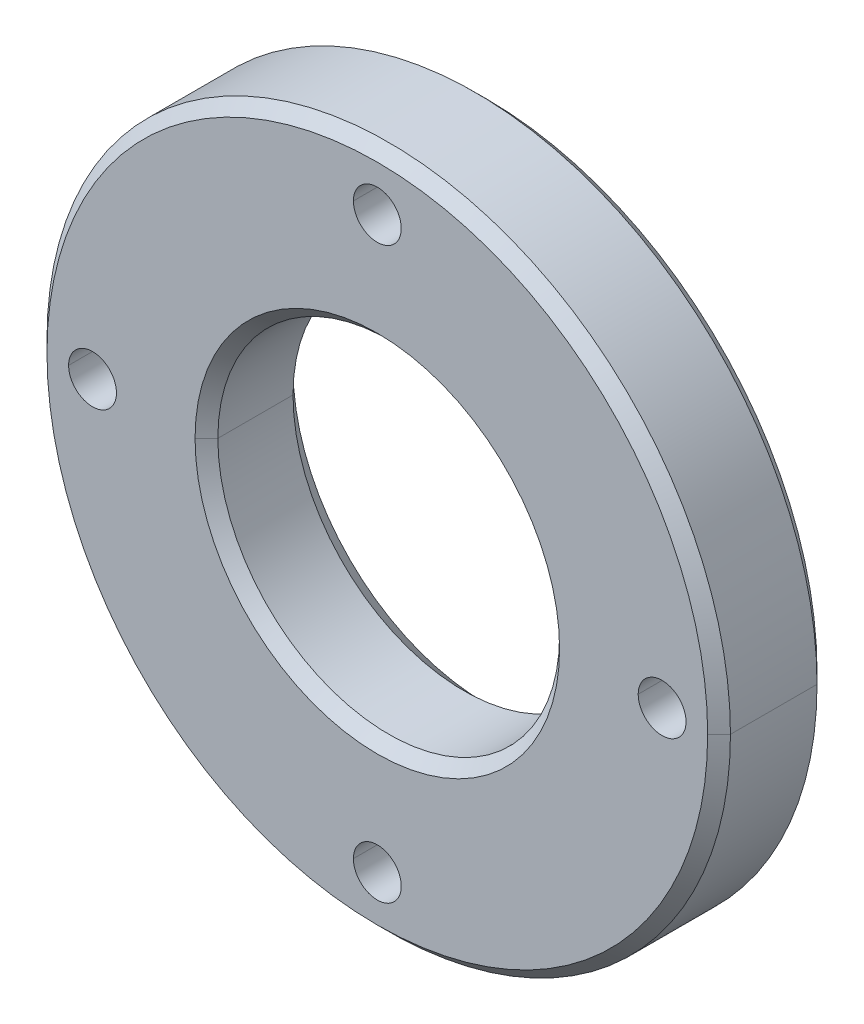
ISO-10303-21;
HEADER;
FILE_DESCRIPTION(('STEP AP214'),'2;1');
FILE_NAME('part.step','',(''),(''),'','','');
FILE_SCHEMA(('AUTOMOTIVE_DESIGN { 1 0 10303 214 1 1 1 1 }'));
ENDSEC;
DATA;
#1=APPLICATION_CONTEXT('core data for automotive mechanical design processes');
#2=APPLICATION_PROTOCOL_DEFINITION('international standard','automotive_design',2000,#1);
#3=PRODUCT_CONTEXT('',#1,'mechanical');
#4=PRODUCT('Part','Part','',(#3));
#5=PRODUCT_RELATED_PRODUCT_CATEGORY('part','',(#4));
#6=PRODUCT_DEFINITION_FORMATION('','',#4);
#7=PRODUCT_DEFINITION_CONTEXT('part definition',#1,'design');
#8=PRODUCT_DEFINITION('design','',#6,#7);
#9=PRODUCT_DEFINITION_SHAPE('','',#8);
#10=(LENGTH_UNIT() NAMED_UNIT(*) SI_UNIT(.MILLI.,.METRE.));
#11=(NAMED_UNIT(*) PLANE_ANGLE_UNIT() SI_UNIT($,.RADIAN.));
#12=(NAMED_UNIT(*) SI_UNIT($,.STERADIAN.) SOLID_ANGLE_UNIT());
#13=UNCERTAINTY_MEASURE_WITH_UNIT(LENGTH_MEASURE(1.E-05),#10,'distance_accuracy_value','');
#14=(GEOMETRIC_REPRESENTATION_CONTEXT(3) GLOBAL_UNCERTAINTY_ASSIGNED_CONTEXT((#13)) GLOBAL_UNIT_ASSIGNED_CONTEXT((#10,
#11,#12)) REPRESENTATION_CONTEXT('',''));
#15=CARTESIAN_POINT('',(0.,0.,0.));
#16=DIRECTION('',(0.,0.,1.));
#17=DIRECTION('',(1.,0.,0.));
#18=AXIS2_PLACEMENT_3D('',#15,#16,#17);
#19=CARTESIAN_POINT('',(0.,14.5,0.));
#20=DIRECTION('',(0.,0.,1.));
#21=DIRECTION('',(1.,0.,0.));
#22=AXIS2_PLACEMENT_3D('',#19,#20,#21);
#23=PLANE('',#22);
#24=CARTESIAN_POINT('',(0.,0.,0.));
#25=DIRECTION('',(0.,0.,-1.));
#26=DIRECTION('',(-1.,0.,0.));
#27=AXIS2_PLACEMENT_3D('',#24,#25,#26);
#28=CIRCLE('',#27,8.);
#29=CARTESIAN_POINT('',(-8.,0.,0.));
#30=VERTEX_POINT('',#29);
#31=CARTESIAN_POINT('',(8.,0.,0.));
#32=VERTEX_POINT('',#31);
#33=EDGE_CURVE('E11',#30,#32,#28,.T.);
#34=ORIENTED_EDGE('',*,*,#33,.T.);
#35=CARTESIAN_POINT('',(0.,0.,0.));
#36=DIRECTION('',(0.,0.,-1.));
#37=DIRECTION('',(-1.,0.,0.));
#38=AXIS2_PLACEMENT_3D('',#35,#36,#37);
#39=CIRCLE('',#38,8.);
#40=EDGE_CURVE('E25',#32,#30,#39,.T.);
#41=ORIENTED_EDGE('',*,*,#40,.T.);
#42=EDGE_LOOP('',(#34,#41));
#43=FACE_BOUND('',#42,.T.);
#44=CARTESIAN_POINT('',(0.,12.5,0.));
#45=DIRECTION('',(0.,0.,-1.));
#46=DIRECTION('',(1.,0.,0.));
#47=AXIS2_PLACEMENT_3D('',#44,#45,#46);
#48=CIRCLE('',#47,1.05);
#49=CARTESIAN_POINT('',(1.05,12.5,0.));
#50=VERTEX_POINT('',#49);
#51=CARTESIAN_POINT('',(-1.05,12.5,0.));
#52=VERTEX_POINT('',#51);
#53=EDGE_CURVE('E143',#50,#52,#48,.T.);
#54=ORIENTED_EDGE('',*,*,#53,.T.);
#55=CARTESIAN_POINT('',(0.,12.5,0.));
#56=DIRECTION('',(0.,0.,-1.));
#57=DIRECTION('',(1.,0.,0.));
#58=AXIS2_PLACEMENT_3D('',#55,#56,#57);
#59=CIRCLE('',#58,1.05);
#60=EDGE_CURVE('E353',#52,#50,#59,.T.);
#61=ORIENTED_EDGE('',*,*,#60,.T.);
#62=EDGE_LOOP('',(#54,#61));
#63=FACE_BOUND('',#62,.T.);
#64=CARTESIAN_POINT('',(-12.5,0.,0.));
#65=DIRECTION('',(0.,0.,-1.));
#66=DIRECTION('',(-1.,0.,0.));
#67=AXIS2_PLACEMENT_3D('',#64,#65,#66);
#68=CIRCLE('',#67,1.05);
#69=CARTESIAN_POINT('',(-13.55,0.,0.));
#70=VERTEX_POINT('',#69);
#71=CARTESIAN_POINT('',(-11.45,0.,0.));
#72=VERTEX_POINT('',#71);
#73=EDGE_CURVE('E349',#70,#72,#68,.T.);
#74=ORIENTED_EDGE('',*,*,#73,.T.);
#75=CARTESIAN_POINT('',(-12.5,0.,0.));
#76=DIRECTION('',(0.,0.,-1.));
#77=DIRECTION('',(-1.,0.,0.));
#78=AXIS2_PLACEMENT_3D('',#75,#76,#77);
#79=CIRCLE('',#78,1.05);
#80=EDGE_CURVE('E345',#72,#70,#79,.T.);
#81=ORIENTED_EDGE('',*,*,#80,.T.);
#82=EDGE_LOOP('',(#74,#81));
#83=FACE_BOUND('',#82,.T.);
#84=CARTESIAN_POINT('',(0.,-12.5,0.));
#85=DIRECTION('',(0.,0.,-1.));
#86=DIRECTION('',(-1.,0.,0.));
#87=AXIS2_PLACEMENT_3D('',#84,#85,#86);
#88=CIRCLE('',#87,1.05);
#89=CARTESIAN_POINT('',(-1.05,-12.5,0.));
#90=VERTEX_POINT('',#89);
#91=CARTESIAN_POINT('',(1.05,-12.5,0.));
#92=VERTEX_POINT('',#91);
#93=EDGE_CURVE('E341',#90,#92,#88,.T.);
#94=ORIENTED_EDGE('',*,*,#93,.T.);
#95=CARTESIAN_POINT('',(0.,-12.5,0.));
#96=DIRECTION('',(0.,0.,-1.));
#97=DIRECTION('',(-1.,0.,0.));
#98=AXIS2_PLACEMENT_3D('',#95,#96,#97);
#99=CIRCLE('',#98,1.05);
#100=EDGE_CURVE('E337',#92,#90,#99,.T.);
#101=ORIENTED_EDGE('',*,*,#100,.T.);
#102=EDGE_LOOP('',(#94,#101));
#103=FACE_BOUND('',#102,.T.);
#104=CARTESIAN_POINT('',(12.5,0.,0.));
#105=DIRECTION('',(0.,0.,-1.));
#106=DIRECTION('',(-1.,0.,0.));
#107=AXIS2_PLACEMENT_3D('',#104,#105,#106);
#108=CIRCLE('',#107,1.05);
#109=CARTESIAN_POINT('',(11.45,0.,0.));
#110=VERTEX_POINT('',#109);
#111=CARTESIAN_POINT('',(13.55,0.,0.));
#112=VERTEX_POINT('',#111);
#113=EDGE_CURVE('E333',#110,#112,#108,.T.);
#114=ORIENTED_EDGE('',*,*,#113,.T.);
#115=CARTESIAN_POINT('',(12.5,0.,0.));
#116=DIRECTION('',(0.,0.,-1.));
#117=DIRECTION('',(-1.,0.,0.));
#118=AXIS2_PLACEMENT_3D('',#115,#116,#117);
#119=CIRCLE('',#118,1.05);
#120=EDGE_CURVE('E329',#112,#110,#119,.T.);
#121=ORIENTED_EDGE('',*,*,#120,.T.);
#122=EDGE_LOOP('',(#114,#121));
#123=FACE_BOUND('',#122,.T.);
#124=CARTESIAN_POINT('',(0.,0.,0.));
#125=DIRECTION('',(0.,0.,-1.));
#126=DIRECTION('',(-1.,0.,0.));
#127=AXIS2_PLACEMENT_3D('',#124,#125,#126);
#128=CIRCLE('',#127,14.5);
#129=CARTESIAN_POINT('',(14.5,0.,0.));
#130=VERTEX_POINT('',#129);
#131=CARTESIAN_POINT('',(-14.5,0.,0.));
#132=VERTEX_POINT('',#131);
#133=EDGE_CURVE('E324',#130,#132,#128,.T.);
#134=ORIENTED_EDGE('',*,*,#133,.F.);
#135=CARTESIAN_POINT('',(0.,0.,0.));
#136=DIRECTION('',(0.,0.,-1.));
#137=DIRECTION('',(-1.,0.,0.));
#138=AXIS2_PLACEMENT_3D('',#135,#136,#137);
#139=CIRCLE('',#138,14.5);
#140=EDGE_CURVE('E319',#132,#130,#139,.T.);
#141=ORIENTED_EDGE('',*,*,#140,.F.);
#142=EDGE_LOOP('',(#134,#141));
#143=FACE_BOUND('',#142,.T.);
#144=ADVANCED_FACE('F17',(#43,#63,#83,#103,#123,#143),#23,.T.);
#145=CARTESIAN_POINT('',(0.,0.,-0.5));
#146=DIRECTION('',(0.,0.,-1.));
#147=DIRECTION('',(0.,-1.,0.));
#148=AXIS2_PLACEMENT_3D('',#145,#146,#147);
#149=CONICAL_SURFACE('',#148,15.,0.785398163397446);
#150=DIRECTION('',(0.707106781186546,0.,-0.707106781186549));
#151=VECTOR('',#150,1.);
#152=CARTESIAN_POINT('',(14.5,0.,0.));
#153=LINE('',#152,#151);
#154=CARTESIAN_POINT('',(15.,0.,-0.5));
#155=VERTEX_POINT('',#154);
#156=EDGE_CURVE('E315',#130,#155,#153,.T.);
#157=ORIENTED_EDGE('',*,*,#156,.T.);
#158=CARTESIAN_POINT('',(0.,0.,-0.5));
#159=DIRECTION('',(0.,0.,-1.));
#160=DIRECTION('',(-1.,0.,0.));
#161=AXIS2_PLACEMENT_3D('',#158,#159,#160);
#162=CIRCLE('',#161,15.);
#163=CARTESIAN_POINT('',(-15.,0.,-0.5));
#164=VERTEX_POINT('',#163);
#165=EDGE_CURVE('E310',#164,#155,#162,.T.);
#166=ORIENTED_EDGE('',*,*,#165,.F.);
#167=DIRECTION('',(-0.707106781186546,0.,-0.707106781186549));
#168=VECTOR('',#167,1.);
#169=CARTESIAN_POINT('',(-14.5,0.,0.));
#170=LINE('',#169,#168);
#171=EDGE_CURVE('E305',#132,#164,#170,.T.);
#172=ORIENTED_EDGE('',*,*,#171,.F.);
#173=ORIENTED_EDGE('',*,*,#140,.T.);
#174=EDGE_LOOP('',(#157,#166,#172,#173));
#175=FACE_BOUND('',#174,.T.);
#176=ADVANCED_FACE('F367',(#175),#149,.T.);
#177=CARTESIAN_POINT('',(0.,0.,-0.5));
#178=DIRECTION('',(0.,0.,-1.));
#179=DIRECTION('',(0.,1.,0.));
#180=AXIS2_PLACEMENT_3D('',#177,#178,#179);
#181=CONICAL_SURFACE('',#180,15.,0.785398163397446);
#182=ORIENTED_EDGE('',*,*,#156,.F.);
#183=ORIENTED_EDGE('',*,*,#133,.T.);
#184=ORIENTED_EDGE('',*,*,#171,.T.);
#185=CARTESIAN_POINT('',(0.,0.,-0.5));
#186=DIRECTION('',(0.,0.,-1.));
#187=DIRECTION('',(-1.,0.,0.));
#188=AXIS2_PLACEMENT_3D('',#185,#186,#187);
#189=CIRCLE('',#188,15.);
#190=EDGE_CURVE('E300',#155,#164,#189,.T.);
#191=ORIENTED_EDGE('',*,*,#190,.F.);
#192=EDGE_LOOP('',(#182,#183,#184,#191));
#193=FACE_BOUND('',#192,.T.);
#194=ADVANCED_FACE('F381',(#193),#181,.T.);
#195=CARTESIAN_POINT('',(0.,0.,-4.8));
#196=DIRECTION('',(0.,0.,-1.));
#197=DIRECTION('',(0.,1.,0.));
#198=AXIS2_PLACEMENT_3D('',#195,#196,#197);
#199=CYLINDRICAL_SURFACE('',#198,15.);
#200=DIRECTION('',(0.,0.,-1.));
#201=VECTOR('',#200,1.);
#202=CARTESIAN_POINT('',(15.,0.,-0.5));
#203=LINE('',#202,#201);
#204=CARTESIAN_POINT('',(15.,0.,-4.3));
#205=VERTEX_POINT('',#204);
#206=EDGE_CURVE('E295',#155,#205,#203,.T.);
#207=ORIENTED_EDGE('',*,*,#206,.F.);
#208=ORIENTED_EDGE('',*,*,#190,.T.);
#209=DIRECTION('',(0.,0.,-1.));
#210=VECTOR('',#209,1.);
#211=CARTESIAN_POINT('',(-15.,0.,-0.500000000000002));
#212=LINE('',#211,#210);
#213=CARTESIAN_POINT('',(-15.,0.,-4.3));
#214=VERTEX_POINT('',#213);
#215=EDGE_CURVE('E291',#164,#214,#212,.T.);
#216=ORIENTED_EDGE('',*,*,#215,.T.);
#217=CARTESIAN_POINT('',(0.,0.,-4.3));
#218=DIRECTION('',(0.,0.,-1.));
#219=DIRECTION('',(-1.,0.,0.));
#220=AXIS2_PLACEMENT_3D('',#217,#218,#219);
#221=CIRCLE('',#220,15.);
#222=EDGE_CURVE('E286',#205,#214,#221,.T.);
#223=ORIENTED_EDGE('',*,*,#222,.F.);
#224=EDGE_LOOP('',(#207,#208,#216,#223));
#225=FACE_BOUND('',#224,.T.);
#226=ADVANCED_FACE('F386',(#225),#199,.T.);
#227=CARTESIAN_POINT('',(0.,0.,-4.8));
#228=DIRECTION('',(0.,0.,1.));
#229=DIRECTION('',(0.,1.,0.));
#230=AXIS2_PLACEMENT_3D('',#227,#228,#229);
#231=CONICAL_SURFACE('',#230,14.5,0.785398163397448);
#232=DIRECTION('',(-0.707106781186548,0.,0.707106781186548));
#233=VECTOR('',#232,1.);
#234=CARTESIAN_POINT('',(-14.5,0.,-4.8));
#235=LINE('',#234,#233);
#236=CARTESIAN_POINT('',(-14.5,0.,-4.8));
#237=VERTEX_POINT('',#236);
#238=EDGE_CURVE('E281',#237,#214,#235,.T.);
#239=ORIENTED_EDGE('',*,*,#238,.F.);
#240=CARTESIAN_POINT('',(0.,0.,-4.8));
#241=DIRECTION('',(0.,0.,-1.));
#242=DIRECTION('',(-1.,0.,0.));
#243=AXIS2_PLACEMENT_3D('',#240,#241,#242);
#244=CIRCLE('',#243,14.5);
#245=CARTESIAN_POINT('',(14.5,0.,-4.8));
#246=VERTEX_POINT('',#245);
#247=EDGE_CURVE('E276',#246,#237,#244,.T.);
#248=ORIENTED_EDGE('',*,*,#247,.F.);
#249=DIRECTION('',(0.707106781186548,0.,0.707106781186548));
#250=VECTOR('',#249,1.);
#251=CARTESIAN_POINT('',(14.5,0.,-4.8));
#252=LINE('',#251,#250);
#253=EDGE_CURVE('E271',#246,#205,#252,.T.);
#254=ORIENTED_EDGE('',*,*,#253,.T.);
#255=ORIENTED_EDGE('',*,*,#222,.T.);
#256=EDGE_LOOP('',(#239,#248,#254,#255));
#257=FACE_BOUND('',#256,.T.);
#258=ADVANCED_FACE('F395',(#257),#231,.T.);
#259=CARTESIAN_POINT('',(0.,0.,-4.8));
#260=DIRECTION('',(0.,0.,1.));
#261=DIRECTION('',(0.,-1.,0.));
#262=AXIS2_PLACEMENT_3D('',#259,#260,#261);
#263=CONICAL_SURFACE('',#262,14.5,0.785398163397448);
#264=ORIENTED_EDGE('',*,*,#238,.T.);
#265=CARTESIAN_POINT('',(0.,0.,-4.3));
#266=DIRECTION('',(0.,0.,-1.));
#267=DIRECTION('',(-1.,0.,0.));
#268=AXIS2_PLACEMENT_3D('',#265,#266,#267);
#269=CIRCLE('',#268,15.);
#270=EDGE_CURVE('E266',#214,#205,#269,.T.);
#271=ORIENTED_EDGE('',*,*,#270,.T.);
#272=ORIENTED_EDGE('',*,*,#253,.F.);
#273=CARTESIAN_POINT('',(0.,0.,-4.8));
#274=DIRECTION('',(0.,0.,-1.));
#275=DIRECTION('',(-1.,0.,0.));
#276=AXIS2_PLACEMENT_3D('',#273,#274,#275);
#277=CIRCLE('',#276,14.5);
#278=EDGE_CURVE('E261',#237,#246,#277,.T.);
#279=ORIENTED_EDGE('',*,*,#278,.F.);
#280=EDGE_LOOP('',(#264,#271,#272,#279));
#281=FACE_BOUND('',#280,.T.);
#282=ADVANCED_FACE('F393',(#281),#263,.T.);
#283=CARTESIAN_POINT('',(0.,8.5,-4.8));
#284=DIRECTION('',(0.,0.,-1.));
#285=DIRECTION('',(-1.,0.,0.));
#286=AXIS2_PLACEMENT_3D('',#283,#284,#285);
#287=PLANE('',#286);
#288=ORIENTED_EDGE('',*,*,#278,.T.);
#289=ORIENTED_EDGE('',*,*,#247,.T.);
#290=EDGE_LOOP('',(#288,#289));
#291=FACE_BOUND('',#290,.T.);
#292=CARTESIAN_POINT('',(0.,0.,-4.8));
#293=DIRECTION('',(0.,0.,-1.));
#294=DIRECTION('',(-1.,0.,0.));
#295=AXIS2_PLACEMENT_3D('',#292,#293,#294);
#296=CIRCLE('',#295,8.5);
#297=CARTESIAN_POINT('',(8.5,0.,-4.8));
#298=VERTEX_POINT('',#297);
#299=CARTESIAN_POINT('',(-8.5,0.,-4.8));
#300=VERTEX_POINT('',#299);
#301=EDGE_CURVE('E256',#298,#300,#296,.T.);
#302=ORIENTED_EDGE('',*,*,#301,.F.);
#303=CARTESIAN_POINT('',(0.,0.,-4.8));
#304=DIRECTION('',(0.,0.,-1.));
#305=DIRECTION('',(-1.,0.,0.));
#306=AXIS2_PLACEMENT_3D('',#303,#304,#305);
#307=CIRCLE('',#306,8.5);
#308=EDGE_CURVE('E251',#300,#298,#307,.T.);
#309=ORIENTED_EDGE('',*,*,#308,.F.);
#310=EDGE_LOOP('',(#302,#309));
#311=FACE_BOUND('',#310,.T.);
#312=ADVANCED_FACE('F397',(#291,#311),#287,.T.);
#313=CARTESIAN_POINT('',(0.,0.,-3.8));
#314=DIRECTION('',(0.,0.,-1.));
#315=DIRECTION('',(0.,-1.,0.));
#316=AXIS2_PLACEMENT_3D('',#313,#314,#315);
#317=CONICAL_SURFACE('',#316,7.5,0.785398163397449);
#318=DIRECTION('',(0.707106781186548,0.,-0.707106781186547));
#319=VECTOR('',#318,1.);
#320=CARTESIAN_POINT('',(7.5,0.,-3.8));
#321=LINE('',#320,#319);
#322=CARTESIAN_POINT('',(7.5,0.,-3.8));
#323=VERTEX_POINT('',#322);
#324=EDGE_CURVE('E246',#323,#298,#321,.T.);
#325=ORIENTED_EDGE('',*,*,#324,.F.);
#326=CARTESIAN_POINT('',(0.,0.,-3.8));
#327=DIRECTION('',(0.,0.,-1.));
#328=DIRECTION('',(-1.,0.,0.));
#329=AXIS2_PLACEMENT_3D('',#326,#327,#328);
#330=CIRCLE('',#329,7.5);
#331=CARTESIAN_POINT('',(-7.5,0.,-3.8));
#332=VERTEX_POINT('',#331);
#333=EDGE_CURVE('E241',#332,#323,#330,.T.);
#334=ORIENTED_EDGE('',*,*,#333,.F.);
#335=DIRECTION('',(-0.707106781186548,0.,-0.707106781186547));
#336=VECTOR('',#335,1.);
#337=CARTESIAN_POINT('',(-7.5,0.,-3.8));
#338=LINE('',#337,#336);
#339=EDGE_CURVE('E236',#332,#300,#338,.T.);
#340=ORIENTED_EDGE('',*,*,#339,.T.);
#341=ORIENTED_EDGE('',*,*,#308,.T.);
#342=EDGE_LOOP('',(#325,#334,#340,#341));
#343=FACE_BOUND('',#342,.T.);
#344=ADVANCED_FACE('F400',(#343),#317,.F.);
#345=CARTESIAN_POINT('',(0.,0.,-3.8));
#346=DIRECTION('',(0.,0.,-1.));
#347=DIRECTION('',(0.,1.,0.));
#348=AXIS2_PLACEMENT_3D('',#345,#346,#347);
#349=CONICAL_SURFACE('',#348,7.5,0.785398163397449);
#350=ORIENTED_EDGE('',*,*,#324,.T.);
#351=ORIENTED_EDGE('',*,*,#301,.T.);
#352=ORIENTED_EDGE('',*,*,#339,.F.);
#353=CARTESIAN_POINT('',(0.,0.,-3.8));
#354=DIRECTION('',(0.,0.,-1.));
#355=DIRECTION('',(-1.,0.,0.));
#356=AXIS2_PLACEMENT_3D('',#353,#354,#355);
#357=CIRCLE('',#356,7.5);
#358=EDGE_CURVE('E231',#323,#332,#357,.T.);
#359=ORIENTED_EDGE('',*,*,#358,.F.);
#360=EDGE_LOOP('',(#350,#351,#352,#359));
#361=FACE_BOUND('',#360,.T.);
#362=ADVANCED_FACE('F405',(#361),#349,.F.);
#363=CARTESIAN_POINT('',(0.,0.,-4.8));
#364=DIRECTION('',(0.,0.,-1.));
#365=DIRECTION('',(0.,1.,0.));
#366=AXIS2_PLACEMENT_3D('',#363,#364,#365);
#367=CYLINDRICAL_SURFACE('',#366,7.5);
#368=DIRECTION('',(0.,0.,-1.));
#369=VECTOR('',#368,1.);
#370=CARTESIAN_POINT('',(7.5,0.,-0.5));
#371=LINE('',#370,#369);
#372=CARTESIAN_POINT('',(7.5,0.,-0.499999999999999));
#373=VERTEX_POINT('',#372);
#374=EDGE_CURVE('E226',#373,#323,#371,.T.);
#375=ORIENTED_EDGE('',*,*,#374,.T.);
#376=ORIENTED_EDGE('',*,*,#358,.T.);
#377=DIRECTION('',(0.,0.,-1.));
#378=VECTOR('',#377,1.);
#379=CARTESIAN_POINT('',(-7.5,0.,-0.5));
#380=LINE('',#379,#378);
#381=CARTESIAN_POINT('',(-7.5,0.,-0.5));
#382=VERTEX_POINT('',#381);
#383=EDGE_CURVE('E221',#382,#332,#380,.T.);
#384=ORIENTED_EDGE('',*,*,#383,.F.);
#385=CARTESIAN_POINT('',(0.,0.,-0.5));
#386=DIRECTION('',(0.,0.,-1.));
#387=DIRECTION('',(-1.,0.,0.));
#388=AXIS2_PLACEMENT_3D('',#385,#386,#387);
#389=CIRCLE('',#388,7.5);
#390=EDGE_CURVE('E216',#373,#382,#389,.T.);
#391=ORIENTED_EDGE('',*,*,#390,.F.);
#392=EDGE_LOOP('',(#375,#376,#384,#391));
#393=FACE_BOUND('',#392,.T.);
#394=ADVANCED_FACE('F408',(#393),#367,.F.);
#395=CARTESIAN_POINT('',(0.,0.,0.));
#396=DIRECTION('',(0.,0.,1.));
#397=DIRECTION('',(0.,1.,0.));
#398=AXIS2_PLACEMENT_3D('',#395,#396,#397);
#399=CONICAL_SURFACE('',#398,8.,0.785398163397449);
#400=DIRECTION('',(-0.707106781186548,0.,0.707106781186547));
#401=VECTOR('',#400,1.);
#402=CARTESIAN_POINT('',(-7.5,0.,-0.499999999999999));
#403=LINE('',#402,#401);
#404=EDGE_CURVE('E212',#382,#30,#403,.T.);
#405=ORIENTED_EDGE('',*,*,#404,.T.);
#406=ORIENTED_EDGE('',*,*,#40,.F.);
#407=DIRECTION('',(0.707106781186548,0.,0.707106781186547));
#408=VECTOR('',#407,1.);
#409=CARTESIAN_POINT('',(7.5,0.,-0.499999999999999));
#410=LINE('',#409,#408);
#411=EDGE_CURVE('E208',#373,#32,#410,.T.);
#412=ORIENTED_EDGE('',*,*,#411,.F.);
#413=ORIENTED_EDGE('',*,*,#390,.T.);
#414=EDGE_LOOP('',(#405,#406,#412,#413));
#415=FACE_BOUND('',#414,.T.);
#416=ADVANCED_FACE('F418',(#415),#399,.F.);
#417=CARTESIAN_POINT('',(0.,0.,0.));
#418=DIRECTION('',(0.,0.,1.));
#419=DIRECTION('',(0.,-1.,0.));
#420=AXIS2_PLACEMENT_3D('',#417,#418,#419);
#421=CONICAL_SURFACE('',#420,8.,0.785398163397449);
#422=ORIENTED_EDGE('',*,*,#404,.F.);
#423=CARTESIAN_POINT('',(0.,0.,-0.5));
#424=DIRECTION('',(0.,0.,-1.));
#425=DIRECTION('',(-1.,0.,0.));
#426=AXIS2_PLACEMENT_3D('',#423,#424,#425);
#427=CIRCLE('',#426,7.5);
#428=EDGE_CURVE('E203',#382,#373,#427,.T.);
#429=ORIENTED_EDGE('',*,*,#428,.T.);
#430=ORIENTED_EDGE('',*,*,#411,.T.);
#431=ORIENTED_EDGE('',*,*,#33,.F.);
#432=EDGE_LOOP('',(#422,#429,#430,#431));
#433=FACE_BOUND('',#432,.T.);
#434=ADVANCED_FACE('F416',(#433),#421,.F.);
#435=CARTESIAN_POINT('',(0.,0.,-4.8));
#436=DIRECTION('',(0.,0.,-1.));
#437=DIRECTION('',(-2.45264421585441E-11,-1.,0.));
#438=AXIS2_PLACEMENT_3D('',#435,#436,#437);
#439=CYLINDRICAL_SURFACE('',#438,7.5);
#440=ORIENTED_EDGE('',*,*,#374,.F.);
#441=ORIENTED_EDGE('',*,*,#428,.F.);
#442=ORIENTED_EDGE('',*,*,#383,.T.);
#443=ORIENTED_EDGE('',*,*,#333,.T.);
#444=EDGE_LOOP('',(#440,#441,#442,#443));
#445=FACE_BOUND('',#444,.T.);
#446=ADVANCED_FACE('F412',(#445),#439,.F.);
#447=CARTESIAN_POINT('',(0.,0.,-4.8));
#448=DIRECTION('',(0.,0.,-1.));
#449=DIRECTION('',(0.,-1.,0.));
#450=AXIS2_PLACEMENT_3D('',#447,#448,#449);
#451=CYLINDRICAL_SURFACE('',#450,15.);
#452=ORIENTED_EDGE('',*,*,#206,.T.);
#453=ORIENTED_EDGE('',*,*,#270,.F.);
#454=ORIENTED_EDGE('',*,*,#215,.F.);
#455=ORIENTED_EDGE('',*,*,#165,.T.);
#456=EDGE_LOOP('',(#452,#453,#454,#455));
#457=FACE_BOUND('',#456,.T.);
#458=ADVANCED_FACE('F389',(#457),#451,.T.);
#459=CARTESIAN_POINT('',(12.5,0.,-3.5));
#460=DIRECTION('',(0.,0.,-1.));
#461=DIRECTION('',(0.,1.,0.));
#462=AXIS2_PLACEMENT_3D('',#459,#460,#461);
#463=CYLINDRICAL_SURFACE('',#462,1.05);
#464=DIRECTION('',(0.,0.,-1.));
#465=VECTOR('',#464,1.);
#466=CARTESIAN_POINT('',(13.55,0.,0.));
#467=LINE('',#466,#465);
#468=CARTESIAN_POINT('',(13.55,0.,-3.5));
#469=VERTEX_POINT('',#468);
#470=EDGE_CURVE('E199',#112,#469,#467,.T.);
#471=ORIENTED_EDGE('',*,*,#470,.T.);
#472=CARTESIAN_POINT('',(12.5,0.,-3.5));
#473=DIRECTION('',(0.,0.,-1.));
#474=DIRECTION('',(-1.,0.,0.));
#475=AXIS2_PLACEMENT_3D('',#472,#473,#474);
#476=CIRCLE('',#475,1.05);
#477=CARTESIAN_POINT('',(11.45,0.,-3.5));
#478=VERTEX_POINT('',#477);
#479=EDGE_CURVE('E195',#469,#478,#476,.T.);
#480=ORIENTED_EDGE('',*,*,#479,.T.);
#481=DIRECTION('',(0.,0.,-1.));
#482=VECTOR('',#481,1.);
#483=CARTESIAN_POINT('',(11.45,0.,0.));
#484=LINE('',#483,#482);
#485=EDGE_CURVE('E190',#110,#478,#484,.T.);
#486=ORIENTED_EDGE('',*,*,#485,.F.);
#487=ORIENTED_EDGE('',*,*,#120,.F.);
#488=EDGE_LOOP('',(#471,#480,#486,#487));
#489=FACE_BOUND('',#488,.T.);
#490=ADVANCED_FACE('F513',(#489),#463,.F.);
#491=CARTESIAN_POINT('',(12.5,0.,-3.5));
#492=DIRECTION('',(0.,0.,-1.));
#493=DIRECTION('',(0.,-1.,0.));
#494=AXIS2_PLACEMENT_3D('',#491,#492,#493);
#495=CYLINDRICAL_SURFACE('',#494,1.05);
#496=ORIENTED_EDGE('',*,*,#470,.F.);
#497=ORIENTED_EDGE('',*,*,#113,.F.);
#498=ORIENTED_EDGE('',*,*,#485,.T.);
#499=CARTESIAN_POINT('',(12.5,0.,-3.5));
#500=DIRECTION('',(0.,0.,-1.));
#501=DIRECTION('',(-1.,0.,0.));
#502=AXIS2_PLACEMENT_3D('',#499,#500,#501);
#503=CIRCLE('',#502,1.05);
#504=EDGE_CURVE('E185',#478,#469,#503,.T.);
#505=ORIENTED_EDGE('',*,*,#504,.T.);
#506=EDGE_LOOP('',(#496,#497,#498,#505));
#507=FACE_BOUND('',#506,.T.);
#508=ADVANCED_FACE('F523',(#507),#495,.F.);
#509=CARTESIAN_POINT('',(12.5,1.05,-3.5));
#510=DIRECTION('',(0.,0.,1.));
#511=DIRECTION('',(1.,0.,0.));
#512=AXIS2_PLACEMENT_3D('',#509,#510,#511);
#513=PLANE('',#512);
#514=ORIENTED_EDGE('',*,*,#479,.F.);
#515=ORIENTED_EDGE('',*,*,#504,.F.);
#516=EDGE_LOOP('',(#514,#515));
#517=FACE_BOUND('',#516,.T.);
#518=ADVANCED_FACE('F534',(#517),#513,.T.);
#519=CARTESIAN_POINT('',(0.,-12.5,-3.5));
#520=DIRECTION('',(0.,0.,-1.));
#521=DIRECTION('',(0.,1.,0.));
#522=AXIS2_PLACEMENT_3D('',#519,#520,#521);
#523=CYLINDRICAL_SURFACE('',#522,1.05);
#524=DIRECTION('',(0.,0.,-1.));
#525=VECTOR('',#524,1.);
#526=CARTESIAN_POINT('',(1.05,-12.5,0.));
#527=LINE('',#526,#525);
#528=CARTESIAN_POINT('',(1.05,-12.5,-3.5));
#529=VERTEX_POINT('',#528);
#530=EDGE_CURVE('E181',#92,#529,#527,.T.);
#531=ORIENTED_EDGE('',*,*,#530,.T.);
#532=CARTESIAN_POINT('',(0.,-12.5,-3.5));
#533=DIRECTION('',(0.,0.,-1.));
#534=DIRECTION('',(-1.,0.,0.));
#535=AXIS2_PLACEMENT_3D('',#532,#533,#534);
#536=CIRCLE('',#535,1.05);
#537=CARTESIAN_POINT('',(-1.05,-12.5,-3.5));
#538=VERTEX_POINT('',#537);
#539=EDGE_CURVE('E177',#529,#538,#536,.T.);
#540=ORIENTED_EDGE('',*,*,#539,.T.);
#541=DIRECTION('',(0.,0.,-1.));
#542=VECTOR('',#541,1.);
#543=CARTESIAN_POINT('',(-1.05,-12.5,0.));
#544=LINE('',#543,#542);
#545=EDGE_CURVE('E172',#90,#538,#544,.T.);
#546=ORIENTED_EDGE('',*,*,#545,.F.);
#547=ORIENTED_EDGE('',*,*,#100,.F.);
#548=EDGE_LOOP('',(#531,#540,#546,#547));
#549=FACE_BOUND('',#548,.T.);
#550=ADVANCED_FACE('F545',(#549),#523,.F.);
#551=CARTESIAN_POINT('',(0.,-12.5,-3.5));
#552=DIRECTION('',(0.,0.,-1.));
#553=DIRECTION('',(0.,-1.,0.));
#554=AXIS2_PLACEMENT_3D('',#551,#552,#553);
#555=CYLINDRICAL_SURFACE('',#554,1.05);
#556=ORIENTED_EDGE('',*,*,#530,.F.);
#557=ORIENTED_EDGE('',*,*,#93,.F.);
#558=ORIENTED_EDGE('',*,*,#545,.T.);
#559=CARTESIAN_POINT('',(0.,-12.5,-3.5));
#560=DIRECTION('',(0.,0.,-1.));
#561=DIRECTION('',(-1.,0.,0.));
#562=AXIS2_PLACEMENT_3D('',#559,#560,#561);
#563=CIRCLE('',#562,1.05);
#564=EDGE_CURVE('E167',#538,#529,#563,.T.);
#565=ORIENTED_EDGE('',*,*,#564,.T.);
#566=EDGE_LOOP('',(#556,#557,#558,#565));
#567=FACE_BOUND('',#566,.T.);
#568=ADVANCED_FACE('F556',(#567),#555,.F.);
#569=CARTESIAN_POINT('',(0.,-11.45,-3.5));
#570=DIRECTION('',(0.,0.,1.));
#571=DIRECTION('',(1.,0.,0.));
#572=AXIS2_PLACEMENT_3D('',#569,#570,#571);
#573=PLANE('',#572);
#574=ORIENTED_EDGE('',*,*,#539,.F.);
#575=ORIENTED_EDGE('',*,*,#564,.F.);
#576=EDGE_LOOP('',(#574,#575));
#577=FACE_BOUND('',#576,.T.);
#578=ADVANCED_FACE('F567',(#577),#573,.T.);
#579=CARTESIAN_POINT('',(-12.5,0.,-3.5));
#580=DIRECTION('',(0.,0.,-1.));
#581=DIRECTION('',(0.,1.,0.));
#582=AXIS2_PLACEMENT_3D('',#579,#580,#581);
#583=CYLINDRICAL_SURFACE('',#582,1.05);
#584=DIRECTION('',(0.,0.,-1.));
#585=VECTOR('',#584,1.);
#586=CARTESIAN_POINT('',(-11.45,0.,0.));
#587=LINE('',#586,#585);
#588=CARTESIAN_POINT('',(-11.45,0.,-3.5));
#589=VERTEX_POINT('',#588);
#590=EDGE_CURVE('E163',#72,#589,#587,.T.);
#591=ORIENTED_EDGE('',*,*,#590,.T.);
#592=CARTESIAN_POINT('',(-12.5,0.,-3.5));
#593=DIRECTION('',(0.,0.,-1.));
#594=DIRECTION('',(-1.,0.,0.));
#595=AXIS2_PLACEMENT_3D('',#592,#593,#594);
#596=CIRCLE('',#595,1.05);
#597=CARTESIAN_POINT('',(-13.55,0.,-3.5));
#598=VERTEX_POINT('',#597);
#599=EDGE_CURVE('E159',#589,#598,#596,.T.);
#600=ORIENTED_EDGE('',*,*,#599,.T.);
#601=DIRECTION('',(0.,0.,-1.));
#602=VECTOR('',#601,1.);
#603=CARTESIAN_POINT('',(-13.55,0.,0.));
#604=LINE('',#603,#602);
#605=EDGE_CURVE('E147',#70,#598,#604,.T.);
#606=ORIENTED_EDGE('',*,*,#605,.F.);
#607=ORIENTED_EDGE('',*,*,#80,.F.);
#608=EDGE_LOOP('',(#591,#600,#606,#607));
#609=FACE_BOUND('',#608,.T.);
#610=ADVANCED_FACE('F578',(#609),#583,.F.);
#611=CARTESIAN_POINT('',(-12.5,0.,-3.5));
#612=DIRECTION('',(0.,0.,-1.));
#613=DIRECTION('',(0.,-1.,0.));
#614=AXIS2_PLACEMENT_3D('',#611,#612,#613);
#615=CYLINDRICAL_SURFACE('',#614,1.05);
#616=ORIENTED_EDGE('',*,*,#590,.F.);
#617=ORIENTED_EDGE('',*,*,#73,.F.);
#618=ORIENTED_EDGE('',*,*,#605,.T.);
#619=CARTESIAN_POINT('',(-12.5,0.,-3.5));
#620=DIRECTION('',(0.,0.,-1.));
#621=DIRECTION('',(-1.,0.,0.));
#622=AXIS2_PLACEMENT_3D('',#619,#620,#621);
#623=CIRCLE('',#622,1.05);
#624=EDGE_CURVE('E144',#598,#589,#623,.T.);
#625=ORIENTED_EDGE('',*,*,#624,.T.);
#626=EDGE_LOOP('',(#616,#617,#618,#625));
#627=FACE_BOUND('',#626,.T.);
#628=ADVANCED_FACE('F589',(#627),#615,.F.);
#629=CARTESIAN_POINT('',(-12.5,1.05,-3.5));
#630=DIRECTION('',(0.,0.,1.));
#631=DIRECTION('',(1.,0.,0.));
#632=AXIS2_PLACEMENT_3D('',#629,#630,#631);
#633=PLANE('',#632);
#634=ORIENTED_EDGE('',*,*,#599,.F.);
#635=ORIENTED_EDGE('',*,*,#624,.F.);
#636=EDGE_LOOP('',(#634,#635));
#637=FACE_BOUND('',#636,.T.);
#638=ADVANCED_FACE('F600',(#637),#633,.T.);
#639=CARTESIAN_POINT('',(0.,12.5,-3.5));
#640=DIRECTION('',(0.,0.,-1.));
#641=DIRECTION('',(0.,-1.,0.));
#642=AXIS2_PLACEMENT_3D('',#639,#640,#641);
#643=CYLINDRICAL_SURFACE('',#642,1.05);
#644=DIRECTION('',(0.,0.,-1.));
#645=VECTOR('',#644,1.);
#646=CARTESIAN_POINT('',(1.05,12.5,0.));
#647=LINE('',#646,#645);
#648=CARTESIAN_POINT('',(1.05,12.5,-3.5));
#649=VERTEX_POINT('',#648);
#650=EDGE_CURVE('E131',#50,#649,#647,.T.);
#651=ORIENTED_EDGE('',*,*,#650,.F.);
#652=ORIENTED_EDGE('',*,*,#60,.F.);
#653=DIRECTION('',(0.,0.,-1.));
#654=VECTOR('',#653,1.);
#655=CARTESIAN_POINT('',(-1.05,12.5,0.));
#656=LINE('',#655,#654);
#657=CARTESIAN_POINT('',(-1.05,12.5,-3.5));
#658=VERTEX_POINT('',#657);
#659=EDGE_CURVE('E133',#52,#658,#656,.T.);
#660=ORIENTED_EDGE('',*,*,#659,.T.);
#661=CARTESIAN_POINT('',(0.,12.5,-3.5));
#662=DIRECTION('',(0.,0.,-1.));
#663=DIRECTION('',(-1.,0.,0.));
#664=AXIS2_PLACEMENT_3D('',#661,#662,#663);
#665=CIRCLE('',#664,1.05);
#666=EDGE_CURVE('E126',#658,#649,#665,.T.);
#667=ORIENTED_EDGE('',*,*,#666,.T.);
#668=EDGE_LOOP('',(#651,#652,#660,#667));
#669=FACE_BOUND('',#668,.T.);
#670=ADVANCED_FACE('F128',(#669),#643,.F.);
#671=CARTESIAN_POINT('',(0.,13.55,-3.5));
#672=DIRECTION('',(0.,0.,1.));
#673=DIRECTION('',(1.,0.,0.));
#674=AXIS2_PLACEMENT_3D('',#671,#672,#673);
#675=PLANE('',#674);
#676=CARTESIAN_POINT('',(0.,12.5,-3.5));
#677=DIRECTION('',(0.,0.,-1.));
#678=DIRECTION('',(-1.,0.,0.));
#679=AXIS2_PLACEMENT_3D('',#676,#677,#678);
#680=CIRCLE('',#679,1.05);
#681=EDGE_CURVE('E136',#649,#658,#680,.T.);
#682=ORIENTED_EDGE('',*,*,#681,.F.);
#683=ORIENTED_EDGE('',*,*,#666,.F.);
#684=EDGE_LOOP('',(#682,#683));
#685=FACE_BOUND('',#684,.T.);
#686=ADVANCED_FACE('F138',(#685),#675,.T.);
#687=CARTESIAN_POINT('',(0.,12.5,-3.5));
#688=DIRECTION('',(0.,0.,-1.));
#689=DIRECTION('',(0.,1.,0.));
#690=AXIS2_PLACEMENT_3D('',#687,#688,#689);
#691=CYLINDRICAL_SURFACE('',#690,1.05);
#692=ORIENTED_EDGE('',*,*,#650,.T.);
#693=ORIENTED_EDGE('',*,*,#681,.T.);
#694=ORIENTED_EDGE('',*,*,#659,.F.);
#695=ORIENTED_EDGE('',*,*,#53,.F.);
#696=EDGE_LOOP('',(#692,#693,#694,#695));
#697=FACE_BOUND('',#696,.T.);
#698=ADVANCED_FACE('F142',(#697),#691,.F.);
#699=CLOSED_SHELL('',(#144,#176,#194,#226,#258,#282,#312,#344,#362,#394,#416,#434,#446,#458,
#490,#508,#518,#550,#568,#578,#610,#628,#638,#670,#686,#698));
#700=MANIFOLD_SOLID_BREP('B1',#699);
#701=ADVANCED_BREP_SHAPE_REPRESENTATION('',(#18,#700),#14);
#702=SHAPE_DEFINITION_REPRESENTATION(#9,#701);
ENDSEC;
END-ISO-10303-21;
